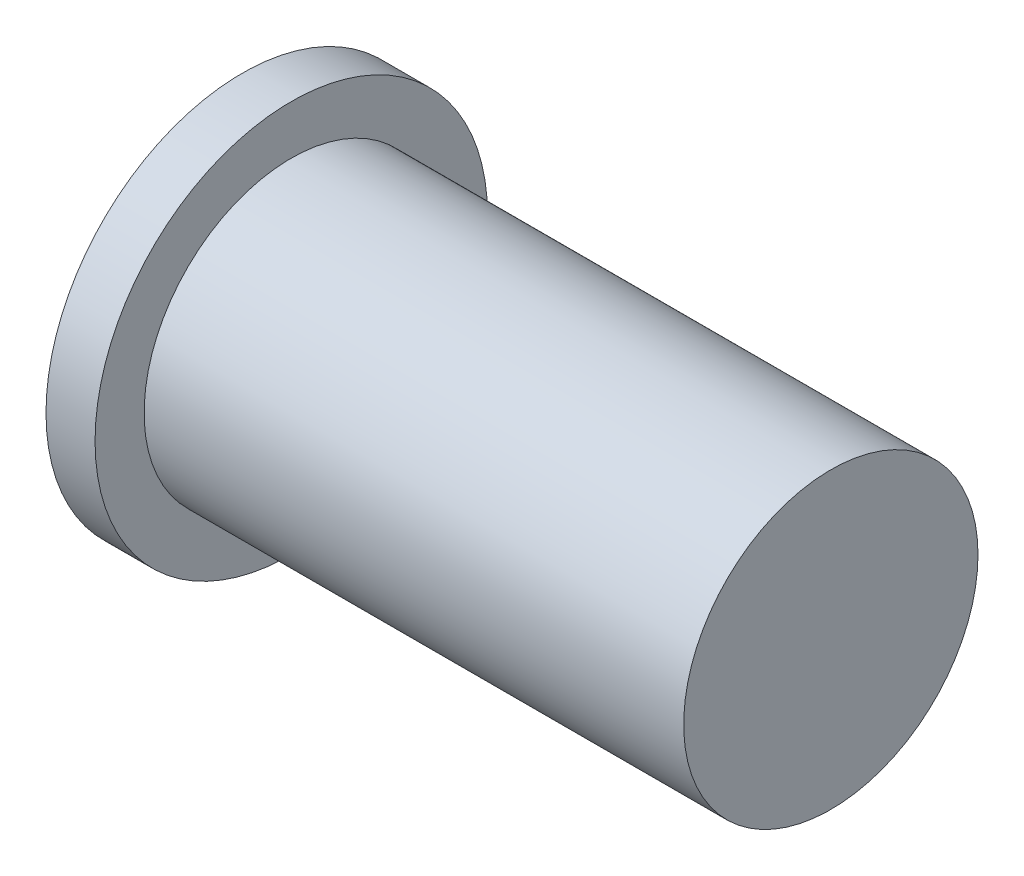
ISO-10303-21;
HEADER;
FILE_DESCRIPTION(('STEP AP214'),'2;1');
FILE_NAME('part.step','',(''),(''),'','','');
FILE_SCHEMA(('AUTOMOTIVE_DESIGN { 1 0 10303 214 1 1 1 1 }'));
ENDSEC;
DATA;
#1=APPLICATION_CONTEXT('core data for automotive mechanical design processes');
#2=APPLICATION_PROTOCOL_DEFINITION('international standard','automotive_design',2000,#1);
#3=PRODUCT_CONTEXT('',#1,'mechanical');
#4=PRODUCT('Part','Part','',(#3));
#5=PRODUCT_RELATED_PRODUCT_CATEGORY('part','',(#4));
#6=PRODUCT_DEFINITION_FORMATION('','',#4);
#7=PRODUCT_DEFINITION_CONTEXT('part definition',#1,'design');
#8=PRODUCT_DEFINITION('design','',#6,#7);
#9=PRODUCT_DEFINITION_SHAPE('','',#8);
#10=(LENGTH_UNIT() NAMED_UNIT(*) SI_UNIT(.MILLI.,.METRE.));
#11=(NAMED_UNIT(*) PLANE_ANGLE_UNIT() SI_UNIT($,.RADIAN.));
#12=(NAMED_UNIT(*) SI_UNIT($,.STERADIAN.) SOLID_ANGLE_UNIT());
#13=UNCERTAINTY_MEASURE_WITH_UNIT(LENGTH_MEASURE(1.E-05),#10,'distance_accuracy_value','');
#14=(GEOMETRIC_REPRESENTATION_CONTEXT(3) GLOBAL_UNCERTAINTY_ASSIGNED_CONTEXT((#13)) GLOBAL_UNIT_ASSIGNED_CONTEXT((#10,
#11,#12)) REPRESENTATION_CONTEXT('',''));
#15=CARTESIAN_POINT('',(0.,0.,0.));
#16=DIRECTION('',(0.,0.,1.));
#17=DIRECTION('',(1.,0.,0.));
#18=AXIS2_PLACEMENT_3D('',#15,#16,#17);
#19=CARTESIAN_POINT('',(1.,0.,-0.107705652229604));
#20=DIRECTION('',(1.,0.,0.));
#21=DIRECTION('',(0.,0.,-1.));
#22=AXIS2_PLACEMENT_3D('',#19,#20,#21);
#23=PLANE('',#22);
#24=CARTESIAN_POINT('',(1.,0.,-0.107705652229604));
#25=DIRECTION('',(1.,0.,0.));
#26=DIRECTION('',(0.,0.,-1.));
#27=AXIS2_PLACEMENT_3D('',#24,#25,#26);
#28=CIRCLE('',#27,4.);
#29=CARTESIAN_POINT('',(1.,0.,-4.1077056522296));
#30=VERTEX_POINT('',#29);
#31=EDGE_CURVE('E10',#30,#30,#28,.T.);
#32=ORIENTED_EDGE('',*,*,#31,.T.);
#33=EDGE_LOOP('',(#32));
#34=FACE_BOUND('',#33,.T.);
#35=CARTESIAN_POINT('',(1.,0.,-0.107705652229603));
#36=DIRECTION('',(1.,0.,0.));
#37=DIRECTION('',(0.,0.,-1.));
#38=AXIS2_PLACEMENT_3D('',#35,#36,#37);
#39=CIRCLE('',#38,3.);
#40=CARTESIAN_POINT('',(1.,0.,-3.1077056522296));
#41=VERTEX_POINT('',#40);
#42=EDGE_CURVE('E42',#41,#41,#39,.T.);
#43=ORIENTED_EDGE('',*,*,#42,.F.);
#44=EDGE_LOOP('',(#43));
#45=FACE_BOUND('',#44,.T.);
#46=ADVANCED_FACE('F31',(#34,#45),#23,.T.);
#47=CARTESIAN_POINT('',(0.,0.,-0.107705652229604));
#48=DIRECTION('',(1.,0.,0.));
#49=DIRECTION('',(0.,0.,-1.));
#50=AXIS2_PLACEMENT_3D('',#47,#48,#49);
#51=PLANE('',#50);
#52=CARTESIAN_POINT('',(0.,0.,-0.107705652229604));
#53=DIRECTION('',(1.,0.,0.));
#54=DIRECTION('',(0.,0.,-1.));
#55=AXIS2_PLACEMENT_3D('',#52,#53,#54);
#56=CIRCLE('',#55,4.);
#57=CARTESIAN_POINT('',(0.,0.,-4.1077056522296));
#58=VERTEX_POINT('',#57);
#59=EDGE_CURVE('E35',#58,#58,#56,.T.);
#60=ORIENTED_EDGE('',*,*,#59,.F.);
#61=EDGE_LOOP('',(#60));
#62=FACE_BOUND('',#61,.T.);
#63=ADVANCED_FACE('F61',(#62),#51,.F.);
#64=CARTESIAN_POINT('',(1.,0.,-0.107705652229604));
#65=DIRECTION('',(-1.,0.,0.));
#66=DIRECTION('',(0.,0.,1.));
#67=AXIS2_PLACEMENT_3D('',#64,#65,#66);
#68=CYLINDRICAL_SURFACE('',#67,4.);
#69=ORIENTED_EDGE('',*,*,#31,.F.);
#70=EDGE_LOOP('',(#69));
#71=FACE_BOUND('',#70,.T.);
#72=ORIENTED_EDGE('',*,*,#59,.T.);
#73=EDGE_LOOP('',(#72));
#74=FACE_BOUND('',#73,.T.);
#75=ADVANCED_FACE('F33',(#71,#74),#68,.T.);
#76=CARTESIAN_POINT('',(12.,0.,-0.107705652229603));
#77=DIRECTION('',(-1.,0.,0.));
#78=DIRECTION('',(0.,0.,1.));
#79=AXIS2_PLACEMENT_3D('',#76,#77,#78);
#80=CYLINDRICAL_SURFACE('',#79,3.);
#81=ORIENTED_EDGE('',*,*,#42,.T.);
#82=EDGE_LOOP('',(#81));
#83=FACE_BOUND('',#82,.T.);
#84=CARTESIAN_POINT('',(12.,0.,-0.107705652229603));
#85=DIRECTION('',(1.,0.,0.));
#86=DIRECTION('',(0.,0.,-1.));
#87=AXIS2_PLACEMENT_3D('',#84,#85,#86);
#88=CIRCLE('',#87,3.);
#89=CARTESIAN_POINT('',(12.,0.,-3.1077056522296));
#90=VERTEX_POINT('',#89);
#91=EDGE_CURVE('E46',#90,#90,#88,.T.);
#92=ORIENTED_EDGE('',*,*,#91,.F.);
#93=EDGE_LOOP('',(#92));
#94=FACE_BOUND('',#93,.T.);
#95=ADVANCED_FACE('F52',(#83,#94),#80,.T.);
#96=CARTESIAN_POINT('',(12.,0.,0.));
#97=DIRECTION('',(1.,0.,0.));
#98=DIRECTION('',(0.,0.,-1.));
#99=AXIS2_PLACEMENT_3D('',#96,#97,#98);
#100=PLANE('',#99);
#101=ORIENTED_EDGE('',*,*,#91,.T.);
#102=EDGE_LOOP('',(#101));
#103=FACE_BOUND('',#102,.T.);
#104=ADVANCED_FACE('F50',(#103),#100,.T.);
#105=CLOSED_SHELL('',(#46,#63,#75,#95,#104));
#106=MANIFOLD_SOLID_BREP('B2',#105);
#107=ADVANCED_BREP_SHAPE_REPRESENTATION('',(#18,#106),#14);
#108=SHAPE_DEFINITION_REPRESENTATION(#9,#107);
ENDSEC;
END-ISO-10303-21;
